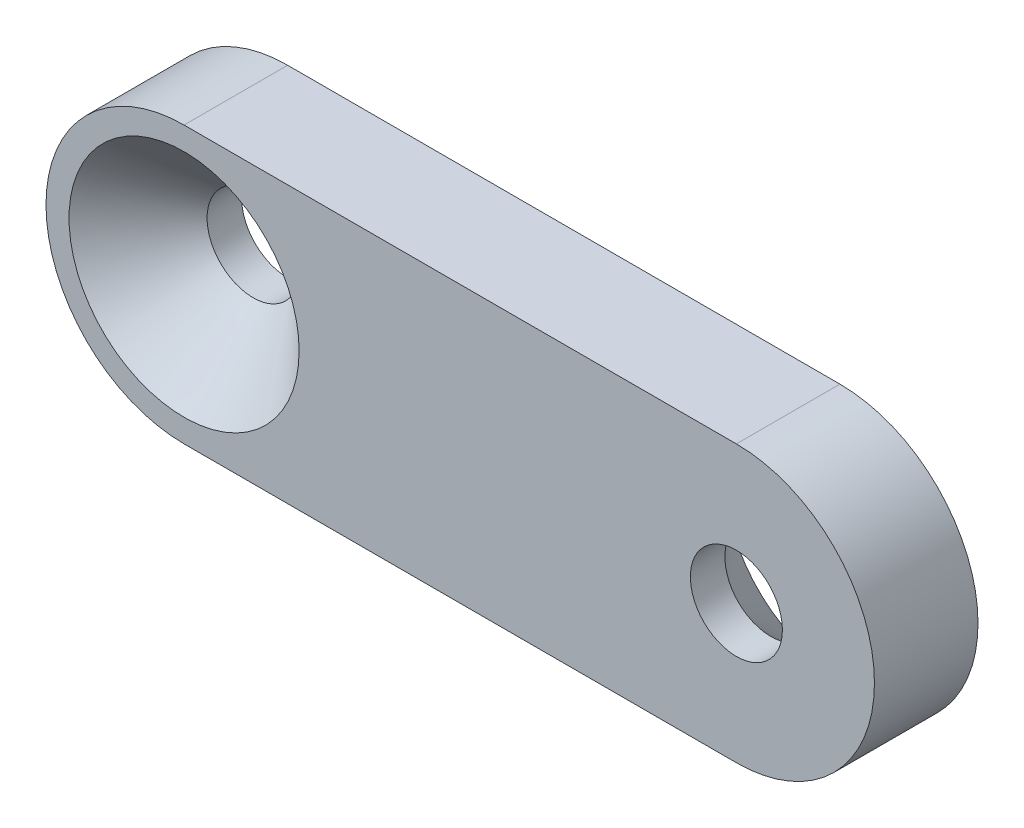
ISO-10303-21;
HEADER;
FILE_DESCRIPTION(('STEP AP214'),'2;1');
FILE_NAME('part.step','',(''),(''),'','','');
FILE_SCHEMA(('AUTOMOTIVE_DESIGN { 1 0 10303 214 1 1 1 1 }'));
ENDSEC;
DATA;
#1=APPLICATION_CONTEXT('core data for automotive mechanical design processes');
#2=APPLICATION_PROTOCOL_DEFINITION('international standard','automotive_design',2000,#1);
#3=PRODUCT_CONTEXT('',#1,'mechanical');
#4=PRODUCT('Part','Part','',(#3));
#5=PRODUCT_RELATED_PRODUCT_CATEGORY('part','',(#4));
#6=PRODUCT_DEFINITION_FORMATION('','',#4);
#7=PRODUCT_DEFINITION_CONTEXT('part definition',#1,'design');
#8=PRODUCT_DEFINITION('design','',#6,#7);
#9=PRODUCT_DEFINITION_SHAPE('','',#8);
#10=(LENGTH_UNIT() NAMED_UNIT(*) SI_UNIT(.MILLI.,.METRE.));
#11=(NAMED_UNIT(*) PLANE_ANGLE_UNIT() SI_UNIT($,.RADIAN.));
#12=(NAMED_UNIT(*) SI_UNIT($,.STERADIAN.) SOLID_ANGLE_UNIT());
#13=UNCERTAINTY_MEASURE_WITH_UNIT(LENGTH_MEASURE(1.E-05),#10,'distance_accuracy_value','');
#14=(GEOMETRIC_REPRESENTATION_CONTEXT(3) GLOBAL_UNCERTAINTY_ASSIGNED_CONTEXT((#13)) GLOBAL_UNIT_ASSIGNED_CONTEXT((#10,
#11,#12)) REPRESENTATION_CONTEXT('',''));
#15=CARTESIAN_POINT('',(0.,0.,0.));
#16=DIRECTION('',(0.,0.,1.));
#17=DIRECTION('',(1.,0.,0.));
#18=AXIS2_PLACEMENT_3D('',#15,#16,#17);
#19=CARTESIAN_POINT('',(-12.,0.,4.5));
#20=DIRECTION('',(0.,0.,1.));
#21=DIRECTION('',(1.,0.,0.));
#22=AXIS2_PLACEMENT_3D('',#19,#20,#21);
#23=PLANE('',#22);
#24=CARTESIAN_POINT('',(-12.,0.,4.5));
#25=DIRECTION('',(0.,0.,1.));
#26=DIRECTION('',(1.,0.,0.));
#27=AXIS2_PLACEMENT_3D('',#24,#25,#26);
#28=CIRCLE('',#27,5.00000000000001);
#29=CARTESIAN_POINT('',(-6.99999999999999,0.,4.5));
#30=VERTEX_POINT('',#29);
#31=EDGE_CURVE('E11',#30,#30,#28,.F.);
#32=ORIENTED_EDGE('',*,*,#31,.T.);
#33=EDGE_LOOP('',(#32));
#34=FACE_BOUND('',#33,.T.);
#35=CARTESIAN_POINT('',(-12.,0.,4.5));
#36=DIRECTION('',(0.,0.,1.));
#37=DIRECTION('',(1.,0.,0.));
#38=AXIS2_PLACEMENT_3D('',#35,#36,#37);
#39=CIRCLE('',#38,6.);
#40=CARTESIAN_POINT('',(-12.,6.,4.5));
#41=VERTEX_POINT('',#40);
#42=CARTESIAN_POINT('',(-12.,-6.,4.5));
#43=VERTEX_POINT('',#42);
#44=EDGE_CURVE('E88',#41,#43,#39,.T.);
#45=ORIENTED_EDGE('',*,*,#44,.T.);
#46=DIRECTION('',(1.,0.,0.));
#47=VECTOR('',#46,1.);
#48=CARTESIAN_POINT('',(-12.,-6.,4.5));
#49=LINE('',#48,#47);
#50=CARTESIAN_POINT('',(12.,-6.,4.5));
#51=VERTEX_POINT('',#50);
#52=EDGE_CURVE('E83',#43,#51,#49,.T.);
#53=ORIENTED_EDGE('',*,*,#52,.T.);
#54=CARTESIAN_POINT('',(12.,0.,4.5));
#55=DIRECTION('',(0.,0.,1.));
#56=DIRECTION('',(1.,0.,0.));
#57=AXIS2_PLACEMENT_3D('',#54,#55,#56);
#58=CIRCLE('',#57,6.);
#59=CARTESIAN_POINT('',(12.,6.,4.5));
#60=VERTEX_POINT('',#59);
#61=EDGE_CURVE('E86',#51,#60,#58,.T.);
#62=ORIENTED_EDGE('',*,*,#61,.T.);
#63=DIRECTION('',(-1.,0.,0.));
#64=VECTOR('',#63,1.);
#65=CARTESIAN_POINT('',(-12.,6.,4.5));
#66=LINE('',#65,#64);
#67=EDGE_CURVE('E52',#60,#41,#66,.T.);
#68=ORIENTED_EDGE('',*,*,#67,.T.);
#69=EDGE_LOOP('',(#45,#53,#62,#68));
#70=FACE_BOUND('',#69,.T.);
#71=CARTESIAN_POINT('',(12.,0.,4.5));
#72=DIRECTION('',(0.,0.,1.));
#73=DIRECTION('',(1.,0.,0.));
#74=AXIS2_PLACEMENT_3D('',#71,#72,#73);
#75=CIRCLE('',#74,2.);
#76=CARTESIAN_POINT('',(14.,0.,4.5));
#77=VERTEX_POINT('',#76);
#78=EDGE_CURVE('E162',#77,#77,#75,.T.);
#79=ORIENTED_EDGE('',*,*,#78,.F.);
#80=EDGE_LOOP('',(#79));
#81=FACE_BOUND('',#80,.T.);
#82=ADVANCED_FACE('F35',(#34,#70,#81),#23,.T.);
#83=CARTESIAN_POINT('',(-12.,0.,0.));
#84=DIRECTION('',(0.,0.,1.));
#85=DIRECTION('',(1.,0.,0.));
#86=AXIS2_PLACEMENT_3D('',#83,#84,#85);
#87=PLANE('',#86);
#88=CARTESIAN_POINT('',(12.,0.,0.));
#89=DIRECTION('',(0.,0.,1.));
#90=DIRECTION('',(1.,0.,0.));
#91=AXIS2_PLACEMENT_3D('',#88,#89,#90);
#92=CIRCLE('',#91,4.99999999999999);
#93=CARTESIAN_POINT('',(17.,0.,0.));
#94=VERTEX_POINT('',#93);
#95=EDGE_CURVE('E113',#94,#94,#92,.T.);
#96=ORIENTED_EDGE('',*,*,#95,.T.);
#97=EDGE_LOOP('',(#96));
#98=FACE_BOUND('',#97,.T.);
#99=CARTESIAN_POINT('',(-12.,0.,0.));
#100=DIRECTION('',(0.,0.,1.));
#101=DIRECTION('',(1.,0.,0.));
#102=AXIS2_PLACEMENT_3D('',#99,#100,#101);
#103=CIRCLE('',#102,2.);
#104=CARTESIAN_POINT('',(-10.,0.,0.));
#105=VERTEX_POINT('',#104);
#106=EDGE_CURVE('E106',#105,#105,#103,.T.);
#107=ORIENTED_EDGE('',*,*,#106,.T.);
#108=EDGE_LOOP('',(#107));
#109=FACE_BOUND('',#108,.T.);
#110=CARTESIAN_POINT('',(-12.,0.,0.));
#111=DIRECTION('',(0.,0.,1.));
#112=DIRECTION('',(1.,0.,0.));
#113=AXIS2_PLACEMENT_3D('',#110,#111,#112);
#114=CIRCLE('',#113,6.);
#115=CARTESIAN_POINT('',(-12.,6.,0.));
#116=VERTEX_POINT('',#115);
#117=CARTESIAN_POINT('',(-12.,-6.,0.));
#118=VERTEX_POINT('',#117);
#119=EDGE_CURVE('E103',#116,#118,#114,.T.);
#120=ORIENTED_EDGE('',*,*,#119,.F.);
#121=DIRECTION('',(-1.,0.,0.));
#122=VECTOR('',#121,1.);
#123=CARTESIAN_POINT('',(-12.,6.,0.));
#124=LINE('',#123,#122);
#125=CARTESIAN_POINT('',(12.,6.,0.));
#126=VERTEX_POINT('',#125);
#127=EDGE_CURVE('E75',#126,#116,#124,.T.);
#128=ORIENTED_EDGE('',*,*,#127,.F.);
#129=CARTESIAN_POINT('',(12.,0.,0.));
#130=DIRECTION('',(0.,0.,1.));
#131=DIRECTION('',(1.,0.,0.));
#132=AXIS2_PLACEMENT_3D('',#129,#130,#131);
#133=CIRCLE('',#132,6.);
#134=CARTESIAN_POINT('',(12.,-6.,0.));
#135=VERTEX_POINT('',#134);
#136=EDGE_CURVE('E69',#135,#126,#133,.T.);
#137=ORIENTED_EDGE('',*,*,#136,.F.);
#138=DIRECTION('',(1.,0.,0.));
#139=VECTOR('',#138,1.);
#140=CARTESIAN_POINT('',(-12.,-6.,0.));
#141=LINE('',#140,#139);
#142=EDGE_CURVE('E93',#118,#135,#141,.T.);
#143=ORIENTED_EDGE('',*,*,#142,.F.);
#144=EDGE_LOOP('',(#120,#128,#137,#143));
#145=FACE_BOUND('',#144,.T.);
#146=ADVANCED_FACE('F134',(#98,#109,#145),#87,.F.);
#147=CARTESIAN_POINT('',(-12.,0.,4.5));
#148=DIRECTION('',(0.,0.,-1.));
#149=DIRECTION('',(-1.,0.,0.));
#150=AXIS2_PLACEMENT_3D('',#147,#148,#149);
#151=CYLINDRICAL_SURFACE('',#150,6.);
#152=ORIENTED_EDGE('',*,*,#119,.T.);
#153=DIRECTION('',(0.,0.,-1.));
#154=VECTOR('',#153,1.);
#155=CARTESIAN_POINT('',(-12.,-6.,4.5));
#156=LINE('',#155,#154);
#157=EDGE_CURVE('E94',#43,#118,#156,.T.);
#158=ORIENTED_EDGE('',*,*,#157,.F.);
#159=ORIENTED_EDGE('',*,*,#44,.F.);
#160=DIRECTION('',(0.,0.,-1.));
#161=VECTOR('',#160,1.);
#162=CARTESIAN_POINT('',(-12.,6.,4.5));
#163=LINE('',#162,#161);
#164=EDGE_CURVE('E99',#41,#116,#163,.T.);
#165=ORIENTED_EDGE('',*,*,#164,.T.);
#166=EDGE_LOOP('',(#152,#158,#159,#165));
#167=FACE_BOUND('',#166,.T.);
#168=ADVANCED_FACE('F140',(#167),#151,.T.);
#169=CARTESIAN_POINT('',(-12.,-6.,4.5));
#170=DIRECTION('',(0.,1.,0.));
#171=DIRECTION('',(0.,0.,1.));
#172=AXIS2_PLACEMENT_3D('',#169,#170,#171);
#173=PLANE('',#172);
#174=ORIENTED_EDGE('',*,*,#142,.T.);
#175=DIRECTION('',(0.,0.,-1.));
#176=VECTOR('',#175,1.);
#177=CARTESIAN_POINT('',(12.,-6.,4.5));
#178=LINE('',#177,#176);
#179=EDGE_CURVE('E91',#51,#135,#178,.T.);
#180=ORIENTED_EDGE('',*,*,#179,.F.);
#181=ORIENTED_EDGE('',*,*,#52,.F.);
#182=ORIENTED_EDGE('',*,*,#157,.T.);
#183=EDGE_LOOP('',(#174,#180,#181,#182));
#184=FACE_BOUND('',#183,.T.);
#185=ADVANCED_FACE('F92',(#184),#173,.F.);
#186=CARTESIAN_POINT('',(12.,0.,4.5));
#187=DIRECTION('',(0.,0.,-1.));
#188=DIRECTION('',(-1.,0.,0.));
#189=AXIS2_PLACEMENT_3D('',#186,#187,#188);
#190=CYLINDRICAL_SURFACE('',#189,6.);
#191=ORIENTED_EDGE('',*,*,#136,.T.);
#192=DIRECTION('',(0.,0.,-1.));
#193=VECTOR('',#192,1.);
#194=CARTESIAN_POINT('',(12.,6.,4.5));
#195=LINE('',#194,#193);
#196=EDGE_CURVE('E95',#60,#126,#195,.T.);
#197=ORIENTED_EDGE('',*,*,#196,.F.);
#198=ORIENTED_EDGE('',*,*,#61,.F.);
#199=ORIENTED_EDGE('',*,*,#179,.T.);
#200=EDGE_LOOP('',(#191,#197,#198,#199));
#201=FACE_BOUND('',#200,.T.);
#202=ADVANCED_FACE('F97',(#201),#190,.T.);
#203=CARTESIAN_POINT('',(-12.,6.,4.5));
#204=DIRECTION('',(0.,-1.,0.));
#205=DIRECTION('',(1.,0.,0.));
#206=AXIS2_PLACEMENT_3D('',#203,#204,#205);
#207=PLANE('',#206);
#208=ORIENTED_EDGE('',*,*,#127,.T.);
#209=ORIENTED_EDGE('',*,*,#164,.F.);
#210=ORIENTED_EDGE('',*,*,#67,.F.);
#211=ORIENTED_EDGE('',*,*,#196,.T.);
#212=EDGE_LOOP('',(#208,#209,#210,#211));
#213=FACE_BOUND('',#212,.T.);
#214=ADVANCED_FACE('F146',(#213),#207,.F.);
#215=CARTESIAN_POINT('',(-12.,0.,4.5));
#216=DIRECTION('',(0.,0.,-1.));
#217=DIRECTION('',(-1.,0.,0.));
#218=AXIS2_PLACEMENT_3D('',#215,#216,#217);
#219=CYLINDRICAL_SURFACE('',#218,2.);
#220=CARTESIAN_POINT('',(-12.,0.,1.5));
#221=DIRECTION('',(0.,0.,1.));
#222=DIRECTION('',(1.,0.,0.));
#223=AXIS2_PLACEMENT_3D('',#220,#221,#222);
#224=CIRCLE('',#223,2.);
#225=CARTESIAN_POINT('',(-10.,0.,1.5));
#226=VERTEX_POINT('',#225);
#227=EDGE_CURVE('E44',#226,#226,#224,.T.);
#228=ORIENTED_EDGE('',*,*,#227,.T.);
#229=EDGE_LOOP('',(#228));
#230=FACE_BOUND('',#229,.T.);
#231=ORIENTED_EDGE('',*,*,#106,.F.);
#232=EDGE_LOOP('',(#231));
#233=FACE_BOUND('',#232,.T.);
#234=ADVANCED_FACE('F121',(#230,#233),#219,.F.);
#235=CARTESIAN_POINT('',(12.,0.,4.5));
#236=DIRECTION('',(0.,0.,-1.));
#237=DIRECTION('',(-1.,0.,0.));
#238=AXIS2_PLACEMENT_3D('',#235,#236,#237);
#239=CYLINDRICAL_SURFACE('',#238,2.);
#240=CARTESIAN_POINT('',(12.,0.,3.));
#241=DIRECTION('',(0.,0.,1.));
#242=DIRECTION('',(1.,0.,0.));
#243=AXIS2_PLACEMENT_3D('',#240,#241,#242);
#244=CIRCLE('',#243,2.);
#245=CARTESIAN_POINT('',(14.,0.,3.));
#246=VERTEX_POINT('',#245);
#247=EDGE_CURVE('E116',#246,#246,#244,.F.);
#248=ORIENTED_EDGE('',*,*,#247,.T.);
#249=EDGE_LOOP('',(#248));
#250=FACE_BOUND('',#249,.T.);
#251=ORIENTED_EDGE('',*,*,#78,.T.);
#252=EDGE_LOOP('',(#251));
#253=FACE_BOUND('',#252,.T.);
#254=ADVANCED_FACE('F130',(#250,#253),#239,.F.);
#255=CARTESIAN_POINT('',(12.,0.,0.));
#256=DIRECTION('',(0.,0.,-1.));
#257=DIRECTION('',(-1.,0.,0.));
#258=AXIS2_PLACEMENT_3D('',#255,#256,#257);
#259=CONICAL_SURFACE('',#258,4.99999999999999,0.785398163397447);
#260=ORIENTED_EDGE('',*,*,#247,.F.);
#261=EDGE_LOOP('',(#260));
#262=FACE_BOUND('',#261,.T.);
#263=ORIENTED_EDGE('',*,*,#95,.F.);
#264=EDGE_LOOP('',(#263));
#265=FACE_BOUND('',#264,.T.);
#266=ADVANCED_FACE('F125',(#262,#265),#259,.F.);
#267=CARTESIAN_POINT('',(-12.,0.,1.5));
#268=DIRECTION('',(0.,0.,1.));
#269=DIRECTION('',(1.,0.,0.));
#270=AXIS2_PLACEMENT_3D('',#267,#268,#269);
#271=CONICAL_SURFACE('',#270,2.,0.78539816339745);
#272=ORIENTED_EDGE('',*,*,#31,.F.);
#273=EDGE_LOOP('',(#272));
#274=FACE_BOUND('',#273,.T.);
#275=ORIENTED_EDGE('',*,*,#227,.F.);
#276=EDGE_LOOP('',(#275));
#277=FACE_BOUND('',#276,.T.);
#278=ADVANCED_FACE('F37',(#274,#277),#271,.F.);
#279=CLOSED_SHELL('',(#82,#146,#168,#185,#202,#214,#234,#254,#266,#278));
#280=MANIFOLD_SOLID_BREP('B2',#279);
#281=ADVANCED_BREP_SHAPE_REPRESENTATION('',(#18,#280),#14);
#282=SHAPE_DEFINITION_REPRESENTATION(#9,#281);
ENDSEC;
END-ISO-10303-21;
